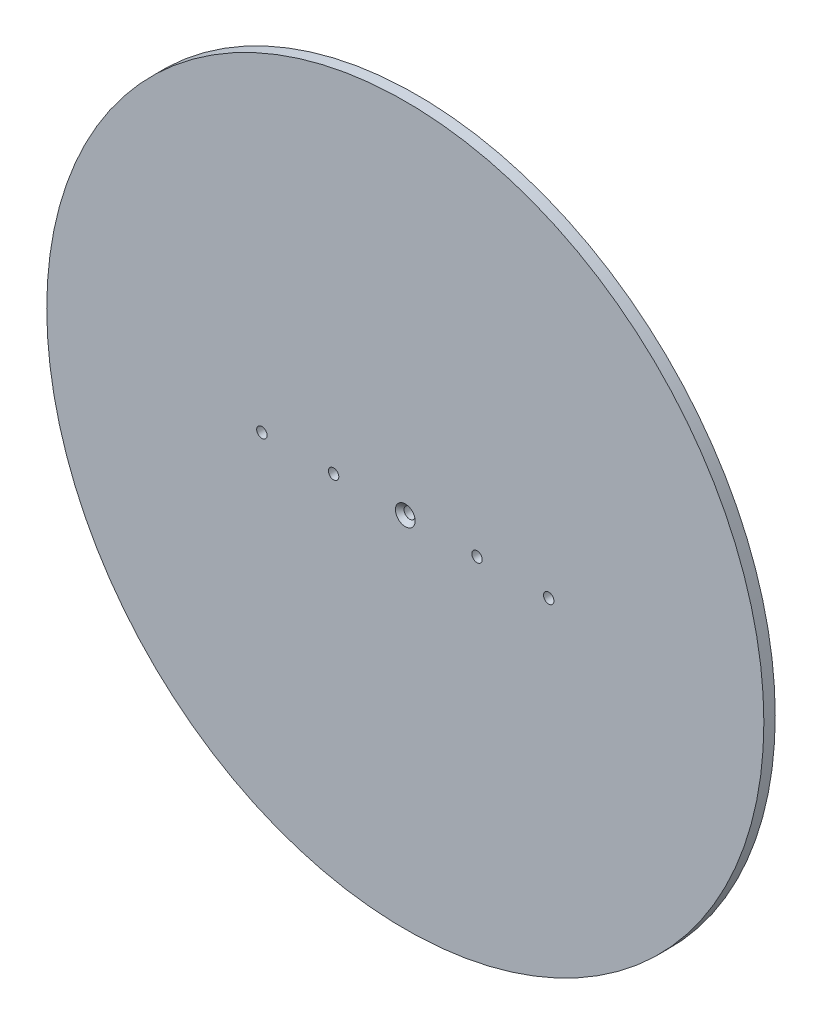
ISO-10303-21;
HEADER;
FILE_DESCRIPTION(('STEP AP214'),'2;1');
FILE_NAME('part.step','',(''),(''),'','','');
FILE_SCHEMA(('AUTOMOTIVE_DESIGN { 1 0 10303 214 1 1 1 1 }'));
ENDSEC;
DATA;
#1=APPLICATION_CONTEXT('core data for automotive mechanical design processes');
#2=APPLICATION_PROTOCOL_DEFINITION('international standard','automotive_design',2000,#1);
#3=PRODUCT_CONTEXT('',#1,'mechanical');
#4=PRODUCT('Part','Part','',(#3));
#5=PRODUCT_RELATED_PRODUCT_CATEGORY('part','',(#4));
#6=PRODUCT_DEFINITION_FORMATION('','',#4);
#7=PRODUCT_DEFINITION_CONTEXT('part definition',#1,'design');
#8=PRODUCT_DEFINITION('design','',#6,#7);
#9=PRODUCT_DEFINITION_SHAPE('','',#8);
#10=(LENGTH_UNIT() NAMED_UNIT(*) SI_UNIT(.MILLI.,.METRE.));
#11=(NAMED_UNIT(*) PLANE_ANGLE_UNIT() SI_UNIT($,.RADIAN.));
#12=(NAMED_UNIT(*) SI_UNIT($,.STERADIAN.) SOLID_ANGLE_UNIT());
#13=UNCERTAINTY_MEASURE_WITH_UNIT(LENGTH_MEASURE(1.E-05),#10,'distance_accuracy_value','');
#14=(GEOMETRIC_REPRESENTATION_CONTEXT(3) GLOBAL_UNCERTAINTY_ASSIGNED_CONTEXT((#13)) GLOBAL_UNIT_ASSIGNED_CONTEXT((#10,
#11,#12)) REPRESENTATION_CONTEXT('',''));
#15=CARTESIAN_POINT('',(0.,0.,0.));
#16=DIRECTION('',(0.,0.,1.));
#17=DIRECTION('',(1.,0.,0.));
#18=AXIS2_PLACEMENT_3D('',#15,#16,#17);
#19=CARTESIAN_POINT('',(0.,0.,3.175));
#20=DIRECTION('',(0.,0.,-1.));
#21=DIRECTION('',(-1.,0.,0.));
#22=AXIS2_PLACEMENT_3D('',#19,#20,#21);
#23=CYLINDRICAL_SURFACE('',#22,100.);
#24=CARTESIAN_POINT('',(0.,0.,3.175));
#25=DIRECTION('',(0.,0.,1.));
#26=DIRECTION('',(1.,0.,0.));
#27=AXIS2_PLACEMENT_3D('',#24,#25,#26);
#28=CIRCLE('',#27,100.);
#29=CARTESIAN_POINT('',(100.,0.,3.175));
#30=VERTEX_POINT('',#29);
#31=EDGE_CURVE('E10',#30,#30,#28,.T.);
#32=ORIENTED_EDGE('',*,*,#31,.F.);
#33=EDGE_LOOP('',(#32));
#34=FACE_BOUND('',#33,.T.);
#35=CARTESIAN_POINT('',(0.,0.,0.));
#36=DIRECTION('',(0.,0.,1.));
#37=DIRECTION('',(1.,0.,0.));
#38=AXIS2_PLACEMENT_3D('',#35,#36,#37);
#39=CIRCLE('',#38,100.);
#40=CARTESIAN_POINT('',(100.,0.,0.));
#41=VERTEX_POINT('',#40);
#42=EDGE_CURVE('E50',#41,#41,#39,.T.);
#43=ORIENTED_EDGE('',*,*,#42,.T.);
#44=EDGE_LOOP('',(#43));
#45=FACE_BOUND('',#44,.T.);
#46=ADVANCED_FACE('F43',(#34,#45),#23,.T.);
#47=CARTESIAN_POINT('',(0.,0.,3.175));
#48=DIRECTION('',(0.,0.,1.));
#49=DIRECTION('',(1.,0.,0.));
#50=AXIS2_PLACEMENT_3D('',#47,#48,#49);
#51=PLANE('',#50);
#52=CARTESIAN_POINT('',(40.,0.,3.175));
#53=DIRECTION('',(0.,0.,1.));
#54=DIRECTION('',(1.,0.,0.));
#55=AXIS2_PLACEMENT_3D('',#52,#53,#54);
#56=CIRCLE('',#55,1.45);
#57=CARTESIAN_POINT('',(41.45,0.,3.175));
#58=VERTEX_POINT('',#57);
#59=EDGE_CURVE('E86',#58,#58,#56,.T.);
#60=ORIENTED_EDGE('',*,*,#59,.F.);
#61=EDGE_LOOP('',(#60));
#62=FACE_BOUND('',#61,.T.);
#63=CARTESIAN_POINT('',(20.,0.,3.175));
#64=DIRECTION('',(0.,0.,1.));
#65=DIRECTION('',(1.,0.,0.));
#66=AXIS2_PLACEMENT_3D('',#63,#64,#65);
#67=CIRCLE('',#66,1.45);
#68=CARTESIAN_POINT('',(21.45,0.,3.175));
#69=VERTEX_POINT('',#68);
#70=EDGE_CURVE('E83',#69,#69,#67,.T.);
#71=ORIENTED_EDGE('',*,*,#70,.F.);
#72=EDGE_LOOP('',(#71));
#73=FACE_BOUND('',#72,.T.);
#74=CARTESIAN_POINT('',(-40.,0.,3.175));
#75=DIRECTION('',(0.,0.,1.));
#76=DIRECTION('',(1.,0.,0.));
#77=AXIS2_PLACEMENT_3D('',#74,#75,#76);
#78=CIRCLE('',#77,1.45);
#79=CARTESIAN_POINT('',(-38.55,0.,3.175));
#80=VERTEX_POINT('',#79);
#81=EDGE_CURVE('E75',#80,#80,#78,.T.);
#82=ORIENTED_EDGE('',*,*,#81,.F.);
#83=EDGE_LOOP('',(#82));
#84=FACE_BOUND('',#83,.T.);
#85=CARTESIAN_POINT('',(-20.,0.,3.175));
#86=DIRECTION('',(0.,0.,1.));
#87=DIRECTION('',(1.,0.,0.));
#88=AXIS2_PLACEMENT_3D('',#85,#86,#87);
#89=CIRCLE('',#88,1.45);
#90=CARTESIAN_POINT('',(-18.55,0.,3.175));
#91=VERTEX_POINT('',#90);
#92=EDGE_CURVE('E65',#91,#91,#89,.T.);
#93=ORIENTED_EDGE('',*,*,#92,.F.);
#94=EDGE_LOOP('',(#93));
#95=FACE_BOUND('',#94,.T.);
#96=CARTESIAN_POINT('',(0.,0.,3.175));
#97=DIRECTION('',(0.,0.,1.));
#98=DIRECTION('',(1.,0.,0.));
#99=AXIS2_PLACEMENT_3D('',#96,#97,#98);
#100=CIRCLE('',#99,2.75);
#101=CARTESIAN_POINT('',(2.75,0.,3.175));
#102=VERTEX_POINT('',#101);
#103=EDGE_CURVE('E64',#102,#102,#100,.T.);
#104=ORIENTED_EDGE('',*,*,#103,.F.);
#105=EDGE_LOOP('',(#104));
#106=FACE_BOUND('',#105,.T.);
#107=ORIENTED_EDGE('',*,*,#31,.T.);
#108=EDGE_LOOP('',(#107));
#109=FACE_BOUND('',#108,.T.);
#110=ADVANCED_FACE('F108',(#62,#73,#84,#95,#106,#109),#51,.T.);
#111=CARTESIAN_POINT('',(0.,0.,0.));
#112=DIRECTION('',(0.,0.,1.));
#113=DIRECTION('',(1.,0.,0.));
#114=AXIS2_PLACEMENT_3D('',#111,#112,#113);
#115=PLANE('',#114);
#116=CARTESIAN_POINT('',(40.,0.,0.));
#117=DIRECTION('',(0.,0.,1.));
#118=DIRECTION('',(1.,0.,0.));
#119=AXIS2_PLACEMENT_3D('',#116,#117,#118);
#120=CIRCLE('',#119,1.45);
#121=CARTESIAN_POINT('',(41.45,0.,0.));
#122=VERTEX_POINT('',#121);
#123=EDGE_CURVE('E46',#122,#122,#120,.T.);
#124=ORIENTED_EDGE('',*,*,#123,.T.);
#125=EDGE_LOOP('',(#124));
#126=FACE_BOUND('',#125,.T.);
#127=CARTESIAN_POINT('',(20.,0.,0.));
#128=DIRECTION('',(0.,0.,1.));
#129=DIRECTION('',(1.,0.,0.));
#130=AXIS2_PLACEMENT_3D('',#127,#128,#129);
#131=CIRCLE('',#130,1.45);
#132=CARTESIAN_POINT('',(21.45,0.,0.));
#133=VERTEX_POINT('',#132);
#134=EDGE_CURVE('E80',#133,#133,#131,.T.);
#135=ORIENTED_EDGE('',*,*,#134,.T.);
#136=EDGE_LOOP('',(#135));
#137=FACE_BOUND('',#136,.T.);
#138=CARTESIAN_POINT('',(-40.,0.,0.));
#139=DIRECTION('',(0.,0.,1.));
#140=DIRECTION('',(1.,0.,0.));
#141=AXIS2_PLACEMENT_3D('',#138,#139,#140);
#142=CIRCLE('',#141,1.45);
#143=CARTESIAN_POINT('',(-38.55,0.,0.));
#144=VERTEX_POINT('',#143);
#145=EDGE_CURVE('E70',#144,#144,#142,.T.);
#146=ORIENTED_EDGE('',*,*,#145,.T.);
#147=EDGE_LOOP('',(#146));
#148=FACE_BOUND('',#147,.T.);
#149=CARTESIAN_POINT('',(-20.,0.,0.));
#150=DIRECTION('',(0.,0.,1.));
#151=DIRECTION('',(1.,0.,0.));
#152=AXIS2_PLACEMENT_3D('',#149,#150,#151);
#153=CIRCLE('',#152,1.45);
#154=CARTESIAN_POINT('',(-18.55,0.,0.));
#155=VERTEX_POINT('',#154);
#156=EDGE_CURVE('E62',#155,#155,#153,.T.);
#157=ORIENTED_EDGE('',*,*,#156,.T.);
#158=EDGE_LOOP('',(#157));
#159=FACE_BOUND('',#158,.T.);
#160=CARTESIAN_POINT('',(0.,0.,0.));
#161=DIRECTION('',(0.,0.,1.));
#162=DIRECTION('',(1.,0.,0.));
#163=AXIS2_PLACEMENT_3D('',#160,#161,#162);
#164=CIRCLE('',#163,1.55);
#165=CARTESIAN_POINT('',(1.55,0.,0.));
#166=VERTEX_POINT('',#165);
#167=EDGE_CURVE('E55',#166,#166,#164,.T.);
#168=ORIENTED_EDGE('',*,*,#167,.T.);
#169=EDGE_LOOP('',(#168));
#170=FACE_BOUND('',#169,.T.);
#171=ORIENTED_EDGE('',*,*,#42,.F.);
#172=EDGE_LOOP('',(#171));
#173=FACE_BOUND('',#172,.T.);
#174=ADVANCED_FACE('F93',(#126,#137,#148,#159,#170,#173),#115,.F.);
#175=CARTESIAN_POINT('',(0.,0.,3.175));
#176=DIRECTION('',(0.,0.,1.));
#177=DIRECTION('',(1.,0.,0.));
#178=AXIS2_PLACEMENT_3D('',#175,#176,#177);
#179=CYLINDRICAL_SURFACE('',#178,1.55);
#180=CARTESIAN_POINT('',(0.,0.,1.975));
#181=DIRECTION('',(0.,0.,1.));
#182=DIRECTION('',(1.,0.,0.));
#183=AXIS2_PLACEMENT_3D('',#180,#181,#182);
#184=CIRCLE('',#183,1.55);
#185=CARTESIAN_POINT('',(1.55,0.,1.975));
#186=VERTEX_POINT('',#185);
#187=EDGE_CURVE('E58',#186,#186,#184,.T.);
#188=ORIENTED_EDGE('',*,*,#187,.T.);
#189=EDGE_LOOP('',(#188));
#190=FACE_BOUND('',#189,.T.);
#191=ORIENTED_EDGE('',*,*,#167,.F.);
#192=EDGE_LOOP('',(#191));
#193=FACE_BOUND('',#192,.T.);
#194=ADVANCED_FACE('F120',(#190,#193),#179,.F.);
#195=CARTESIAN_POINT('',(0.,0.,3.175));
#196=DIRECTION('',(0.,0.,1.));
#197=DIRECTION('',(1.,0.,0.));
#198=AXIS2_PLACEMENT_3D('',#195,#196,#197);
#199=CONICAL_SURFACE('',#198,2.75,0.785398163397447);
#200=ORIENTED_EDGE('',*,*,#187,.F.);
#201=EDGE_LOOP('',(#200));
#202=FACE_BOUND('',#201,.T.);
#203=ORIENTED_EDGE('',*,*,#103,.T.);
#204=EDGE_LOOP('',(#203));
#205=FACE_BOUND('',#204,.T.);
#206=ADVANCED_FACE('F125',(#202,#205),#199,.F.);
#207=CARTESIAN_POINT('',(-20.,0.,3.175));
#208=DIRECTION('',(0.,0.,1.));
#209=DIRECTION('',(1.,0.,0.));
#210=AXIS2_PLACEMENT_3D('',#207,#208,#209);
#211=CYLINDRICAL_SURFACE('',#210,1.45);
#212=ORIENTED_EDGE('',*,*,#92,.T.);
#213=EDGE_LOOP('',(#212));
#214=FACE_BOUND('',#213,.T.);
#215=ORIENTED_EDGE('',*,*,#156,.F.);
#216=EDGE_LOOP('',(#215));
#217=FACE_BOUND('',#216,.T.);
#218=ADVANCED_FACE('F131',(#214,#217),#211,.F.);
#219=CARTESIAN_POINT('',(-40.,0.,3.175));
#220=DIRECTION('',(0.,0.,1.));
#221=DIRECTION('',(1.,0.,0.));
#222=AXIS2_PLACEMENT_3D('',#219,#220,#221);
#223=CYLINDRICAL_SURFACE('',#222,1.45);
#224=ORIENTED_EDGE('',*,*,#81,.T.);
#225=EDGE_LOOP('',(#224));
#226=FACE_BOUND('',#225,.T.);
#227=ORIENTED_EDGE('',*,*,#145,.F.);
#228=EDGE_LOOP('',(#227));
#229=FACE_BOUND('',#228,.T.);
#230=ADVANCED_FACE('F104',(#226,#229),#223,.F.);
#231=CARTESIAN_POINT('',(20.,0.,3.175));
#232=DIRECTION('',(0.,0.,1.));
#233=DIRECTION('',(1.,0.,0.));
#234=AXIS2_PLACEMENT_3D('',#231,#232,#233);
#235=CYLINDRICAL_SURFACE('',#234,1.45);
#236=ORIENTED_EDGE('',*,*,#70,.T.);
#237=EDGE_LOOP('',(#236));
#238=FACE_BOUND('',#237,.T.);
#239=ORIENTED_EDGE('',*,*,#134,.F.);
#240=EDGE_LOOP('',(#239));
#241=FACE_BOUND('',#240,.T.);
#242=ADVANCED_FACE('F98',(#238,#241),#235,.F.);
#243=CARTESIAN_POINT('',(40.,0.,3.175));
#244=DIRECTION('',(0.,0.,1.));
#245=DIRECTION('',(1.,0.,0.));
#246=AXIS2_PLACEMENT_3D('',#243,#244,#245);
#247=CYLINDRICAL_SURFACE('',#246,1.45);
#248=ORIENTED_EDGE('',*,*,#59,.T.);
#249=EDGE_LOOP('',(#248));
#250=FACE_BOUND('',#249,.T.);
#251=ORIENTED_EDGE('',*,*,#123,.F.);
#252=EDGE_LOOP('',(#251));
#253=FACE_BOUND('',#252,.T.);
#254=ADVANCED_FACE('F96',(#250,#253),#247,.F.);
#255=CLOSED_SHELL('',(#46,#110,#174,#194,#206,#218,#230,#242,#254));
#256=MANIFOLD_SOLID_BREP('B2',#255);
#257=ADVANCED_BREP_SHAPE_REPRESENTATION('',(#18,#256),#14);
#258=SHAPE_DEFINITION_REPRESENTATION(#9,#257);
ENDSEC;
END-ISO-10303-21;
